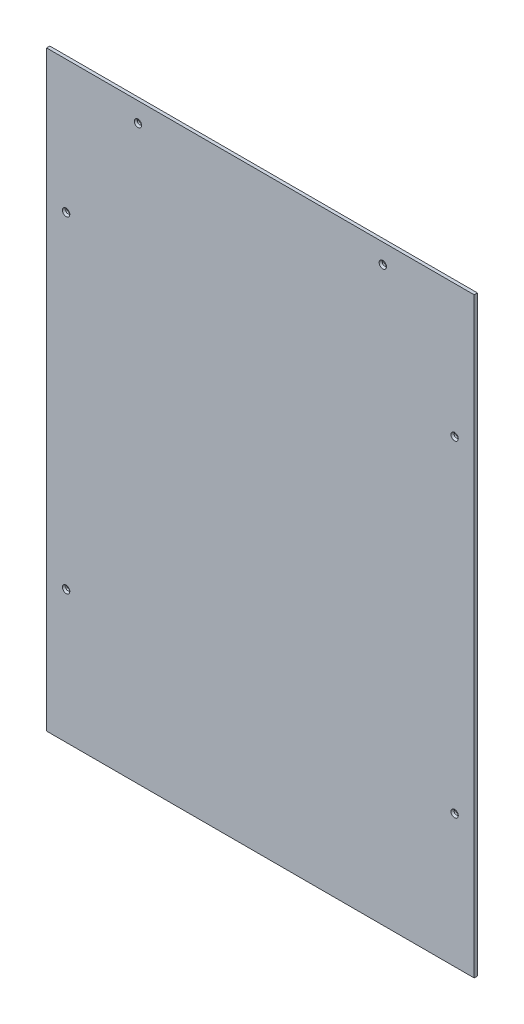
ISO-10303-21;
HEADER;
FILE_DESCRIPTION(('STEP AP214'),'2;1');
FILE_NAME('part.step','',(''),(''),'','','');
FILE_SCHEMA(('AUTOMOTIVE_DESIGN { 1 0 10303 214 1 1 1 1 }'));
ENDSEC;
DATA;
#1=APPLICATION_CONTEXT('core data for automotive mechanical design processes');
#2=APPLICATION_PROTOCOL_DEFINITION('international standard','automotive_design',2000,#1);
#3=PRODUCT_CONTEXT('',#1,'mechanical');
#4=PRODUCT('Part','Part','',(#3));
#5=PRODUCT_RELATED_PRODUCT_CATEGORY('part','',(#4));
#6=PRODUCT_DEFINITION_FORMATION('','',#4);
#7=PRODUCT_DEFINITION_CONTEXT('part definition',#1,'design');
#8=PRODUCT_DEFINITION('design','',#6,#7);
#9=PRODUCT_DEFINITION_SHAPE('','',#8);
#10=(LENGTH_UNIT() NAMED_UNIT(*) SI_UNIT(.MILLI.,.METRE.));
#11=(NAMED_UNIT(*) PLANE_ANGLE_UNIT() SI_UNIT($,.RADIAN.));
#12=(NAMED_UNIT(*) SI_UNIT($,.STERADIAN.) SOLID_ANGLE_UNIT());
#13=UNCERTAINTY_MEASURE_WITH_UNIT(LENGTH_MEASURE(1.E-05),#10,'distance_accuracy_value','');
#14=(GEOMETRIC_REPRESENTATION_CONTEXT(3) GLOBAL_UNCERTAINTY_ASSIGNED_CONTEXT((#13)) GLOBAL_UNIT_ASSIGNED_CONTEXT((#10,
#11,#12)) REPRESENTATION_CONTEXT('',''));
#15=CARTESIAN_POINT('',(0.,0.,0.));
#16=DIRECTION('',(0.,0.,1.));
#17=DIRECTION('',(1.,0.,0.));
#18=AXIS2_PLACEMENT_3D('',#15,#16,#17);
#19=CARTESIAN_POINT('',(262.,-362.5,2.));
#20=DIRECTION('',(-1.,0.,0.));
#21=DIRECTION('',(0.,0.,1.));
#22=AXIS2_PLACEMENT_3D('',#19,#20,#21);
#23=PLANE('',#22);
#24=DIRECTION('',(0.,1.,0.));
#25=VECTOR('',#24,1.);
#26=CARTESIAN_POINT('',(262.,-362.5,-2.));
#27=LINE('',#26,#25);
#28=CARTESIAN_POINT('',(262.,-362.5,-2.));
#29=VERTEX_POINT('',#28);
#30=CARTESIAN_POINT('',(262.,362.5,-2.));
#31=VERTEX_POINT('',#30);
#32=EDGE_CURVE('E118',#29,#31,#27,.T.);
#33=ORIENTED_EDGE('',*,*,#32,.T.);
#34=DIRECTION('',(0.,0.,-1.));
#35=VECTOR('',#34,1.);
#36=CARTESIAN_POINT('',(262.,362.5,2.));
#37=LINE('',#36,#35);
#38=CARTESIAN_POINT('',(262.,362.5,2.));
#39=VERTEX_POINT('',#38);
#40=EDGE_CURVE('E109',#39,#31,#37,.T.);
#41=ORIENTED_EDGE('',*,*,#40,.F.);
#42=DIRECTION('',(0.,1.,0.));
#43=VECTOR('',#42,1.);
#44=CARTESIAN_POINT('',(262.,-362.5,2.));
#45=LINE('',#44,#43);
#46=CARTESIAN_POINT('',(262.,-362.5,2.));
#47=VERTEX_POINT('',#46);
#48=EDGE_CURVE('E103',#47,#39,#45,.T.);
#49=ORIENTED_EDGE('',*,*,#48,.F.);
#50=DIRECTION('',(0.,0.,-1.));
#51=VECTOR('',#50,1.);
#52=CARTESIAN_POINT('',(262.,-362.5,2.));
#53=LINE('',#52,#51);
#54=EDGE_CURVE('E114',#47,#29,#53,.T.);
#55=ORIENTED_EDGE('',*,*,#54,.T.);
#56=EDGE_LOOP('',(#33,#41,#49,#55));
#57=FACE_BOUND('',#56,.T.);
#58=ADVANCED_FACE('F49',(#57),#23,.F.);
#59=CARTESIAN_POINT('',(-262.,362.5,2.));
#60=DIRECTION('',(0.,-1.,0.));
#61=DIRECTION('',(0.,0.,-1.));
#62=AXIS2_PLACEMENT_3D('',#59,#60,#61);
#63=PLANE('',#62);
#64=DIRECTION('',(-1.,0.,0.));
#65=VECTOR('',#64,1.);
#66=CARTESIAN_POINT('',(-262.,362.5,-2.));
#67=LINE('',#66,#65);
#68=CARTESIAN_POINT('',(-262.,362.5,-2.));
#69=VERTEX_POINT('',#68);
#70=EDGE_CURVE('E108',#31,#69,#67,.T.);
#71=ORIENTED_EDGE('',*,*,#70,.T.);
#72=DIRECTION('',(0.,0.,-1.));
#73=VECTOR('',#72,1.);
#74=CARTESIAN_POINT('',(-262.,362.5,2.));
#75=LINE('',#74,#73);
#76=CARTESIAN_POINT('',(-262.,362.5,2.));
#77=VERTEX_POINT('',#76);
#78=EDGE_CURVE('E106',#77,#69,#75,.T.);
#79=ORIENTED_EDGE('',*,*,#78,.F.);
#80=DIRECTION('',(-1.,0.,0.));
#81=VECTOR('',#80,1.);
#82=CARTESIAN_POINT('',(-262.,362.5,2.));
#83=LINE('',#82,#81);
#84=EDGE_CURVE('E98',#39,#77,#83,.T.);
#85=ORIENTED_EDGE('',*,*,#84,.F.);
#86=ORIENTED_EDGE('',*,*,#40,.T.);
#87=EDGE_LOOP('',(#71,#79,#85,#86));
#88=FACE_BOUND('',#87,.T.);
#89=ADVANCED_FACE('F107',(#88),#63,.F.);
#90=CARTESIAN_POINT('',(-262.,-362.5,2.));
#91=DIRECTION('',(1.,0.,0.));
#92=DIRECTION('',(0.,0.,-1.));
#93=AXIS2_PLACEMENT_3D('',#90,#91,#92);
#94=PLANE('',#93);
#95=DIRECTION('',(0.,-1.,0.));
#96=VECTOR('',#95,1.);
#97=CARTESIAN_POINT('',(-262.,-362.5,-2.));
#98=LINE('',#97,#96);
#99=CARTESIAN_POINT('',(-262.,-362.5,-2.));
#100=VERTEX_POINT('',#99);
#101=EDGE_CURVE('E84',#69,#100,#98,.T.);
#102=ORIENTED_EDGE('',*,*,#101,.T.);
#103=DIRECTION('',(0.,0.,-1.));
#104=VECTOR('',#103,1.);
#105=CARTESIAN_POINT('',(-262.,-362.5,2.));
#106=LINE('',#105,#104);
#107=CARTESIAN_POINT('',(-262.,-362.5,2.));
#108=VERTEX_POINT('',#107);
#109=EDGE_CURVE('E110',#108,#100,#106,.T.);
#110=ORIENTED_EDGE('',*,*,#109,.F.);
#111=DIRECTION('',(0.,-1.,0.));
#112=VECTOR('',#111,1.);
#113=CARTESIAN_POINT('',(-262.,-362.5,2.));
#114=LINE('',#113,#112);
#115=EDGE_CURVE('E101',#77,#108,#114,.T.);
#116=ORIENTED_EDGE('',*,*,#115,.F.);
#117=ORIENTED_EDGE('',*,*,#78,.T.);
#118=EDGE_LOOP('',(#102,#110,#116,#117));
#119=FACE_BOUND('',#118,.T.);
#120=ADVANCED_FACE('F112',(#119),#94,.F.);
#121=CARTESIAN_POINT('',(-262.,-362.5,2.));
#122=DIRECTION('',(0.,1.,0.));
#123=DIRECTION('',(0.,0.,1.));
#124=AXIS2_PLACEMENT_3D('',#121,#122,#123);
#125=PLANE('',#124);
#126=DIRECTION('',(1.,0.,0.));
#127=VECTOR('',#126,1.);
#128=CARTESIAN_POINT('',(-262.,-362.5,-2.));
#129=LINE('',#128,#127);
#130=EDGE_CURVE('E90',#100,#29,#129,.T.);
#131=ORIENTED_EDGE('',*,*,#130,.T.);
#132=ORIENTED_EDGE('',*,*,#54,.F.);
#133=DIRECTION('',(1.,0.,0.));
#134=VECTOR('',#133,1.);
#135=CARTESIAN_POINT('',(-262.,-362.5,2.));
#136=LINE('',#135,#134);
#137=EDGE_CURVE('E67',#108,#47,#136,.T.);
#138=ORIENTED_EDGE('',*,*,#137,.F.);
#139=ORIENTED_EDGE('',*,*,#109,.T.);
#140=EDGE_LOOP('',(#131,#132,#138,#139));
#141=FACE_BOUND('',#140,.T.);
#142=ADVANCED_FACE('F262',(#141),#125,.F.);
#143=CARTESIAN_POINT('',(0.,0.,2.));
#144=DIRECTION('',(0.,0.,-1.));
#145=DIRECTION('',(-1.,0.,0.));
#146=AXIS2_PLACEMENT_3D('',#143,#144,#145);
#147=PLANE('',#146);
#148=CARTESIAN_POINT('',(238.,-200.,2.));
#149=DIRECTION('',(0.,0.,-1.));
#150=DIRECTION('',(-1.,0.,0.));
#151=AXIS2_PLACEMENT_3D('',#148,#149,#150);
#152=CIRCLE('',#151,4.50000000000017);
#153=CARTESIAN_POINT('',(233.5,-200.,2.));
#154=VERTEX_POINT('',#153);
#155=EDGE_CURVE('E146',#154,#154,#152,.T.);
#156=ORIENTED_EDGE('',*,*,#155,.T.);
#157=EDGE_LOOP('',(#156));
#158=FACE_BOUND('',#157,.T.);
#159=CARTESIAN_POINT('',(238.,200.,2.));
#160=DIRECTION('',(0.,0.,-1.));
#161=DIRECTION('',(-1.,0.,0.));
#162=AXIS2_PLACEMENT_3D('',#159,#160,#161);
#163=CIRCLE('',#162,4.50000000000017);
#164=CARTESIAN_POINT('',(233.5,200.,2.));
#165=VERTEX_POINT('',#164);
#166=EDGE_CURVE('E143',#165,#165,#163,.T.);
#167=ORIENTED_EDGE('',*,*,#166,.T.);
#168=EDGE_LOOP('',(#167));
#169=FACE_BOUND('',#168,.T.);
#170=CARTESIAN_POINT('',(150.,338.5,2.));
#171=DIRECTION('',(0.,0.,-1.));
#172=DIRECTION('',(-1.,0.,0.));
#173=AXIS2_PLACEMENT_3D('',#170,#171,#172);
#174=CIRCLE('',#173,4.50000000000017);
#175=CARTESIAN_POINT('',(145.5,338.5,2.));
#176=VERTEX_POINT('',#175);
#177=EDGE_CURVE('E140',#176,#176,#174,.T.);
#178=ORIENTED_EDGE('',*,*,#177,.T.);
#179=EDGE_LOOP('',(#178));
#180=FACE_BOUND('',#179,.T.);
#181=CARTESIAN_POINT('',(-150.,338.5,2.));
#182=DIRECTION('',(0.,0.,-1.));
#183=DIRECTION('',(-1.,0.,0.));
#184=AXIS2_PLACEMENT_3D('',#181,#182,#183);
#185=CIRCLE('',#184,4.49999999999995);
#186=CARTESIAN_POINT('',(-154.5,338.5,2.));
#187=VERTEX_POINT('',#186);
#188=EDGE_CURVE('E137',#187,#187,#185,.T.);
#189=ORIENTED_EDGE('',*,*,#188,.T.);
#190=EDGE_LOOP('',(#189));
#191=FACE_BOUND('',#190,.T.);
#192=CARTESIAN_POINT('',(-238.,200.,2.));
#193=DIRECTION('',(0.,0.,-1.));
#194=DIRECTION('',(-1.,0.,0.));
#195=AXIS2_PLACEMENT_3D('',#192,#193,#194);
#196=CIRCLE('',#195,4.49999999999995);
#197=CARTESIAN_POINT('',(-242.5,200.,2.));
#198=VERTEX_POINT('',#197);
#199=EDGE_CURVE('E134',#198,#198,#196,.T.);
#200=ORIENTED_EDGE('',*,*,#199,.T.);
#201=EDGE_LOOP('',(#200));
#202=FACE_BOUND('',#201,.T.);
#203=CARTESIAN_POINT('',(-238.,-200.,2.));
#204=DIRECTION('',(0.,0.,-1.));
#205=DIRECTION('',(-1.,0.,0.));
#206=AXIS2_PLACEMENT_3D('',#203,#204,#205);
#207=CIRCLE('',#206,4.49999999999995);
#208=CARTESIAN_POINT('',(-242.5,-200.,2.));
#209=VERTEX_POINT('',#208);
#210=EDGE_CURVE('E131',#209,#209,#207,.T.);
#211=ORIENTED_EDGE('',*,*,#210,.T.);
#212=EDGE_LOOP('',(#211));
#213=FACE_BOUND('',#212,.T.);
#214=ORIENTED_EDGE('',*,*,#48,.T.);
#215=ORIENTED_EDGE('',*,*,#84,.T.);
#216=ORIENTED_EDGE('',*,*,#115,.T.);
#217=ORIENTED_EDGE('',*,*,#137,.T.);
#218=EDGE_LOOP('',(#214,#215,#216,#217));
#219=FACE_BOUND('',#218,.T.);
#220=ADVANCED_FACE('F99',(#158,#169,#180,#191,#202,#213,#219),#147,.F.);
#221=CARTESIAN_POINT('',(0.,0.,-2.));
#222=DIRECTION('',(0.,0.,-1.));
#223=DIRECTION('',(-1.,0.,0.));
#224=AXIS2_PLACEMENT_3D('',#221,#222,#223);
#225=PLANE('',#224);
#226=CARTESIAN_POINT('',(-150.,338.5,-2.));
#227=DIRECTION('',(0.,0.,1.));
#228=DIRECTION('',(1.,0.,0.));
#229=AXIS2_PLACEMENT_3D('',#226,#227,#228);
#230=CIRCLE('',#229,2.5);
#231=CARTESIAN_POINT('',(-147.5,338.5,-2.));
#232=VERTEX_POINT('',#231);
#233=EDGE_CURVE('E228',#232,#232,#230,.T.);
#234=ORIENTED_EDGE('',*,*,#233,.T.);
#235=EDGE_LOOP('',(#234));
#236=FACE_BOUND('',#235,.T.);
#237=CARTESIAN_POINT('',(238.,200.,-2.));
#238=DIRECTION('',(0.,0.,1.));
#239=DIRECTION('',(1.,0.,0.));
#240=AXIS2_PLACEMENT_3D('',#237,#238,#239);
#241=CIRCLE('',#240,2.5);
#242=CARTESIAN_POINT('',(240.5,200.,-2.));
#243=VERTEX_POINT('',#242);
#244=EDGE_CURVE('E231',#243,#243,#241,.T.);
#245=ORIENTED_EDGE('',*,*,#244,.T.);
#246=EDGE_LOOP('',(#245));
#247=FACE_BOUND('',#246,.T.);
#248=CARTESIAN_POINT('',(238.,-200.,-2.));
#249=DIRECTION('',(0.,0.,1.));
#250=DIRECTION('',(1.,0.,0.));
#251=AXIS2_PLACEMENT_3D('',#248,#249,#250);
#252=CIRCLE('',#251,2.5);
#253=CARTESIAN_POINT('',(240.5,-200.,-2.));
#254=VERTEX_POINT('',#253);
#255=EDGE_CURVE('E235',#254,#254,#252,.T.);
#256=ORIENTED_EDGE('',*,*,#255,.T.);
#257=EDGE_LOOP('',(#256));
#258=FACE_BOUND('',#257,.T.);
#259=CARTESIAN_POINT('',(-238.,200.,-2.));
#260=DIRECTION('',(0.,0.,1.));
#261=DIRECTION('',(1.,0.,0.));
#262=AXIS2_PLACEMENT_3D('',#259,#260,#261);
#263=CIRCLE('',#262,2.5);
#264=CARTESIAN_POINT('',(-235.5,200.,-2.));
#265=VERTEX_POINT('',#264);
#266=EDGE_CURVE('E237',#265,#265,#263,.T.);
#267=ORIENTED_EDGE('',*,*,#266,.T.);
#268=EDGE_LOOP('',(#267));
#269=FACE_BOUND('',#268,.T.);
#270=CARTESIAN_POINT('',(150.,338.5,-2.));
#271=DIRECTION('',(0.,0.,1.));
#272=DIRECTION('',(1.,0.,0.));
#273=AXIS2_PLACEMENT_3D('',#270,#271,#272);
#274=CIRCLE('',#273,2.5);
#275=CARTESIAN_POINT('',(152.5,338.5,-2.));
#276=VERTEX_POINT('',#275);
#277=EDGE_CURVE('E226',#276,#276,#274,.T.);
#278=ORIENTED_EDGE('',*,*,#277,.T.);
#279=EDGE_LOOP('',(#278));
#280=FACE_BOUND('',#279,.T.);
#281=CARTESIAN_POINT('',(-238.,-200.,-2.));
#282=DIRECTION('',(0.,0.,1.));
#283=DIRECTION('',(1.,0.,0.));
#284=AXIS2_PLACEMENT_3D('',#281,#282,#283);
#285=CIRCLE('',#284,2.5);
#286=CARTESIAN_POINT('',(-235.5,-200.,-2.));
#287=VERTEX_POINT('',#286);
#288=EDGE_CURVE('E121',#287,#287,#285,.T.);
#289=ORIENTED_EDGE('',*,*,#288,.T.);
#290=EDGE_LOOP('',(#289));
#291=FACE_BOUND('',#290,.T.);
#292=ORIENTED_EDGE('',*,*,#32,.F.);
#293=ORIENTED_EDGE('',*,*,#130,.F.);
#294=ORIENTED_EDGE('',*,*,#101,.F.);
#295=ORIENTED_EDGE('',*,*,#70,.F.);
#296=EDGE_LOOP('',(#292,#293,#294,#295));
#297=FACE_BOUND('',#296,.T.);
#298=ADVANCED_FACE('F245',(#236,#247,#258,#269,#280,#291,#297),#225,.T.);
#299=CARTESIAN_POINT('',(-238.,-200.,-2.));
#300=DIRECTION('',(0.,0.,1.));
#301=DIRECTION('',(1.,0.,0.));
#302=AXIS2_PLACEMENT_3D('',#299,#300,#301);
#303=CYLINDRICAL_SURFACE('',#302,2.5);
#304=CARTESIAN_POINT('',(-238.,-200.,0.));
#305=DIRECTION('',(0.,0.,-1.));
#306=DIRECTION('',(-1.,0.,0.));
#307=AXIS2_PLACEMENT_3D('',#304,#305,#306);
#308=CIRCLE('',#307,2.5);
#309=CARTESIAN_POINT('',(-240.5,-200.,0.));
#310=VERTEX_POINT('',#309);
#311=EDGE_CURVE('E11',#310,#310,#308,.F.);
#312=ORIENTED_EDGE('',*,*,#311,.T.);
#313=EDGE_LOOP('',(#312));
#314=FACE_BOUND('',#313,.T.);
#315=ORIENTED_EDGE('',*,*,#288,.F.);
#316=EDGE_LOOP('',(#315));
#317=FACE_BOUND('',#316,.T.);
#318=ADVANCED_FACE('F222',(#314,#317),#303,.F.);
#319=CARTESIAN_POINT('',(150.,338.5,-2.));
#320=DIRECTION('',(0.,0.,1.));
#321=DIRECTION('',(1.,0.,0.));
#322=AXIS2_PLACEMENT_3D('',#319,#320,#321);
#323=CYLINDRICAL_SURFACE('',#322,2.5);
#324=CARTESIAN_POINT('',(150.,338.5,-1.83013326715553E-13));
#325=DIRECTION('',(0.,0.,-1.));
#326=DIRECTION('',(-1.,0.,0.));
#327=AXIS2_PLACEMENT_3D('',#324,#325,#326);
#328=CIRCLE('',#327,2.5);
#329=CARTESIAN_POINT('',(147.5,338.5,-1.83013326715553E-13));
#330=VERTEX_POINT('',#329);
#331=EDGE_CURVE('E152',#330,#330,#328,.F.);
#332=ORIENTED_EDGE('',*,*,#331,.T.);
#333=EDGE_LOOP('',(#332));
#334=FACE_BOUND('',#333,.T.);
#335=ORIENTED_EDGE('',*,*,#277,.F.);
#336=EDGE_LOOP('',(#335));
#337=FACE_BOUND('',#336,.T.);
#338=ADVANCED_FACE('F219',(#334,#337),#323,.F.);
#339=CARTESIAN_POINT('',(-238.,200.,-2.));
#340=DIRECTION('',(0.,0.,1.));
#341=DIRECTION('',(1.,0.,0.));
#342=AXIS2_PLACEMENT_3D('',#339,#340,#341);
#343=CYLINDRICAL_SURFACE('',#342,2.5);
#344=CARTESIAN_POINT('',(-238.,200.,0.));
#345=DIRECTION('',(0.,0.,-1.));
#346=DIRECTION('',(-1.,0.,0.));
#347=AXIS2_PLACEMENT_3D('',#344,#345,#346);
#348=CIRCLE('',#347,2.5);
#349=CARTESIAN_POINT('',(-240.5,200.,0.));
#350=VERTEX_POINT('',#349);
#351=EDGE_CURVE('E59',#350,#350,#348,.F.);
#352=ORIENTED_EDGE('',*,*,#351,.T.);
#353=EDGE_LOOP('',(#352));
#354=FACE_BOUND('',#353,.T.);
#355=ORIENTED_EDGE('',*,*,#266,.F.);
#356=EDGE_LOOP('',(#355));
#357=FACE_BOUND('',#356,.T.);
#358=ADVANCED_FACE('F160',(#354,#357),#343,.F.);
#359=CARTESIAN_POINT('',(238.,-200.,-2.));
#360=DIRECTION('',(0.,0.,1.));
#361=DIRECTION('',(1.,0.,0.));
#362=AXIS2_PLACEMENT_3D('',#359,#360,#361);
#363=CYLINDRICAL_SURFACE('',#362,2.5);
#364=CARTESIAN_POINT('',(238.,-200.,-1.83013326715553E-13));
#365=DIRECTION('',(0.,0.,-1.));
#366=DIRECTION('',(-1.,0.,0.));
#367=AXIS2_PLACEMENT_3D('',#364,#365,#366);
#368=CIRCLE('',#367,2.5);
#369=CARTESIAN_POINT('',(235.5,-200.,-1.83013326715553E-13));
#370=VERTEX_POINT('',#369);
#371=EDGE_CURVE('E128',#370,#370,#368,.F.);
#372=ORIENTED_EDGE('',*,*,#371,.T.);
#373=EDGE_LOOP('',(#372));
#374=FACE_BOUND('',#373,.T.);
#375=ORIENTED_EDGE('',*,*,#255,.F.);
#376=EDGE_LOOP('',(#375));
#377=FACE_BOUND('',#376,.T.);
#378=ADVANCED_FACE('F259',(#374,#377),#363,.F.);
#379=CARTESIAN_POINT('',(238.,200.,-2.));
#380=DIRECTION('',(0.,0.,1.));
#381=DIRECTION('',(1.,0.,0.));
#382=AXIS2_PLACEMENT_3D('',#379,#380,#381);
#383=CYLINDRICAL_SURFACE('',#382,2.5);
#384=CARTESIAN_POINT('',(238.,200.,-1.83013326715553E-13));
#385=DIRECTION('',(0.,0.,-1.));
#386=DIRECTION('',(-1.,0.,0.));
#387=AXIS2_PLACEMENT_3D('',#384,#385,#386);
#388=CIRCLE('',#387,2.5);
#389=CARTESIAN_POINT('',(235.5,200.,-1.83013326715553E-13));
#390=VERTEX_POINT('',#389);
#391=EDGE_CURVE('E149',#390,#390,#388,.F.);
#392=ORIENTED_EDGE('',*,*,#391,.T.);
#393=EDGE_LOOP('',(#392));
#394=FACE_BOUND('',#393,.T.);
#395=ORIENTED_EDGE('',*,*,#244,.F.);
#396=EDGE_LOOP('',(#395));
#397=FACE_BOUND('',#396,.T.);
#398=ADVANCED_FACE('F335',(#394,#397),#383,.F.);
#399=CARTESIAN_POINT('',(-150.,338.5,-2.));
#400=DIRECTION('',(0.,0.,1.));
#401=DIRECTION('',(1.,0.,0.));
#402=AXIS2_PLACEMENT_3D('',#399,#400,#401);
#403=CYLINDRICAL_SURFACE('',#402,2.5);
#404=CARTESIAN_POINT('',(-150.,338.5,0.));
#405=DIRECTION('',(0.,0.,-1.));
#406=DIRECTION('',(-1.,0.,0.));
#407=AXIS2_PLACEMENT_3D('',#404,#405,#406);
#408=CIRCLE('',#407,2.5);
#409=CARTESIAN_POINT('',(-152.5,338.5,0.));
#410=VERTEX_POINT('',#409);
#411=EDGE_CURVE('E155',#410,#410,#408,.F.);
#412=ORIENTED_EDGE('',*,*,#411,.T.);
#413=EDGE_LOOP('',(#412));
#414=FACE_BOUND('',#413,.T.);
#415=ORIENTED_EDGE('',*,*,#233,.F.);
#416=EDGE_LOOP('',(#415));
#417=FACE_BOUND('',#416,.T.);
#418=ADVANCED_FACE('F194',(#414,#417),#403,.F.);
#419=CARTESIAN_POINT('',(238.,-200.,-1.83447007584547E-13));
#420=DIRECTION('',(0.,0.,1.));
#421=DIRECTION('',(1.,0.,0.));
#422=AXIS2_PLACEMENT_3D('',#419,#420,#421);
#423=CONICAL_SURFACE('',#422,2.5,0.785398163397446);
#424=ORIENTED_EDGE('',*,*,#155,.F.);
#425=EDGE_LOOP('',(#424));
#426=FACE_BOUND('',#425,.T.);
#427=ORIENTED_EDGE('',*,*,#371,.F.);
#428=EDGE_LOOP('',(#427));
#429=FACE_BOUND('',#428,.T.);
#430=ADVANCED_FACE('F187',(#426,#429),#423,.F.);
#431=CARTESIAN_POINT('',(238.,200.,-1.83447007584547E-13));
#432=DIRECTION('',(0.,0.,1.));
#433=DIRECTION('',(1.,0.,0.));
#434=AXIS2_PLACEMENT_3D('',#431,#432,#433);
#435=CONICAL_SURFACE('',#434,2.5,0.785398163397446);
#436=ORIENTED_EDGE('',*,*,#166,.F.);
#437=EDGE_LOOP('',(#436));
#438=FACE_BOUND('',#437,.T.);
#439=ORIENTED_EDGE('',*,*,#391,.F.);
#440=EDGE_LOOP('',(#439));
#441=FACE_BOUND('',#440,.T.);
#442=ADVANCED_FACE('F193',(#438,#441),#435,.F.);
#443=CARTESIAN_POINT('',(150.,338.5,-1.83447007584547E-13));
#444=DIRECTION('',(0.,0.,1.));
#445=DIRECTION('',(1.,0.,0.));
#446=AXIS2_PLACEMENT_3D('',#443,#444,#445);
#447=CONICAL_SURFACE('',#446,2.5,0.785398163397446);
#448=ORIENTED_EDGE('',*,*,#177,.F.);
#449=EDGE_LOOP('',(#448));
#450=FACE_BOUND('',#449,.T.);
#451=ORIENTED_EDGE('',*,*,#331,.F.);
#452=EDGE_LOOP('',(#451));
#453=FACE_BOUND('',#452,.T.);
#454=ADVANCED_FACE('F172',(#450,#453),#447,.F.);
#455=CARTESIAN_POINT('',(-150.,338.5,0.));
#456=DIRECTION('',(0.,0.,1.));
#457=DIRECTION('',(1.,0.,0.));
#458=AXIS2_PLACEMENT_3D('',#455,#456,#457);
#459=CONICAL_SURFACE('',#458,2.5,0.785398163397418);
#460=ORIENTED_EDGE('',*,*,#188,.F.);
#461=EDGE_LOOP('',(#460));
#462=FACE_BOUND('',#461,.T.);
#463=ORIENTED_EDGE('',*,*,#411,.F.);
#464=EDGE_LOOP('',(#463));
#465=FACE_BOUND('',#464,.T.);
#466=ADVANCED_FACE('F165',(#462,#465),#459,.F.);
#467=CARTESIAN_POINT('',(-238.,200.,0.));
#468=DIRECTION('',(0.,0.,1.));
#469=DIRECTION('',(1.,0.,0.));
#470=AXIS2_PLACEMENT_3D('',#467,#468,#469);
#471=CONICAL_SURFACE('',#470,2.5,0.785398163397418);
#472=ORIENTED_EDGE('',*,*,#199,.F.);
#473=EDGE_LOOP('',(#472));
#474=FACE_BOUND('',#473,.T.);
#475=ORIENTED_EDGE('',*,*,#351,.F.);
#476=EDGE_LOOP('',(#475));
#477=FACE_BOUND('',#476,.T.);
#478=ADVANCED_FACE('F163',(#474,#477),#471,.F.);
#479=CARTESIAN_POINT('',(-238.,-200.,0.));
#480=DIRECTION('',(0.,0.,1.));
#481=DIRECTION('',(1.,0.,0.));
#482=AXIS2_PLACEMENT_3D('',#479,#480,#481);
#483=CONICAL_SURFACE('',#482,2.5,0.785398163397418);
#484=ORIENTED_EDGE('',*,*,#210,.F.);
#485=EDGE_LOOP('',(#484));
#486=FACE_BOUND('',#485,.T.);
#487=ORIENTED_EDGE('',*,*,#311,.F.);
#488=EDGE_LOOP('',(#487));
#489=FACE_BOUND('',#488,.T.);
#490=ADVANCED_FACE('F52',(#486,#489),#483,.F.);
#491=CLOSED_SHELL('',(#58,#89,#120,#142,#220,#298,#318,#338,#358,#378,#398,#418,#430,#442,#454,
#466,#478,#490));
#492=MANIFOLD_SOLID_BREP('B2',#491);
#493=ADVANCED_BREP_SHAPE_REPRESENTATION('',(#18,#492),#14);
#494=SHAPE_DEFINITION_REPRESENTATION(#9,#493);
ENDSEC;
END-ISO-10303-21;
